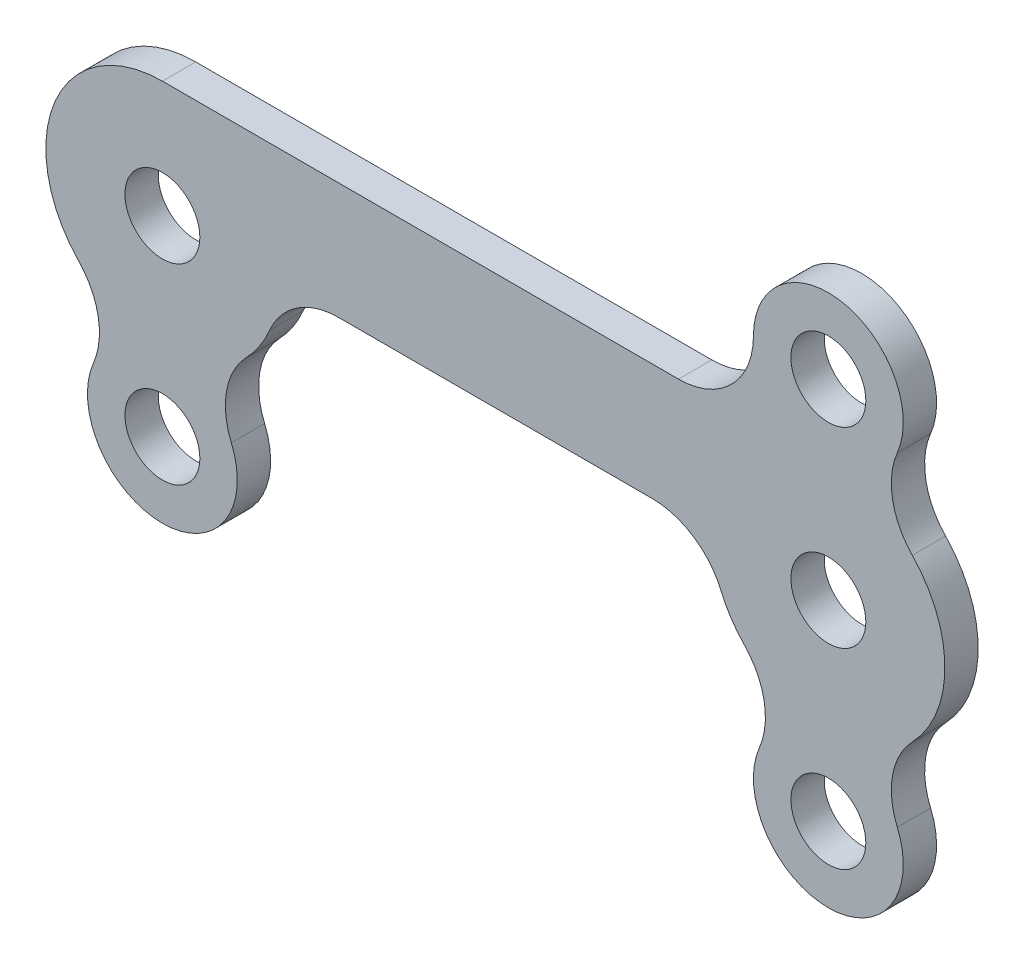
ISO-10303-21;
HEADER;
FILE_DESCRIPTION(('STEP AP214'),'2;1');
FILE_NAME('part.step','',(''),(''),'','','');
FILE_SCHEMA(('AUTOMOTIVE_DESIGN { 1 0 10303 214 1 1 1 1 }'));
ENDSEC;
DATA;
#1=APPLICATION_CONTEXT('core data for automotive mechanical design processes');
#2=APPLICATION_PROTOCOL_DEFINITION('international standard','automotive_design',2000,#1);
#3=PRODUCT_CONTEXT('',#1,'mechanical');
#4=PRODUCT('Part','Part','',(#3));
#5=PRODUCT_RELATED_PRODUCT_CATEGORY('part','',(#4));
#6=PRODUCT_DEFINITION_FORMATION('','',#4);
#7=PRODUCT_DEFINITION_CONTEXT('part definition',#1,'design');
#8=PRODUCT_DEFINITION('design','',#6,#7);
#9=PRODUCT_DEFINITION_SHAPE('','',#8);
#10=(LENGTH_UNIT() NAMED_UNIT(*) SI_UNIT(.MILLI.,.METRE.));
#11=(NAMED_UNIT(*) PLANE_ANGLE_UNIT() SI_UNIT($,.RADIAN.));
#12=(NAMED_UNIT(*) SI_UNIT($,.STERADIAN.) SOLID_ANGLE_UNIT());
#13=UNCERTAINTY_MEASURE_WITH_UNIT(LENGTH_MEASURE(1.E-05),#10,'distance_accuracy_value','');
#14=(GEOMETRIC_REPRESENTATION_CONTEXT(3) GLOBAL_UNCERTAINTY_ASSIGNED_CONTEXT((#13)) GLOBAL_UNIT_ASSIGNED_CONTEXT((#10,
#11,#12)) REPRESENTATION_CONTEXT('',''));
#15=CARTESIAN_POINT('',(0.,0.,0.));
#16=DIRECTION('',(0.,0.,1.));
#17=DIRECTION('',(1.,0.,0.));
#18=AXIS2_PLACEMENT_3D('',#15,#16,#17);
#19=CARTESIAN_POINT('',(31.75,9.128125,1.5875));
#20=DIRECTION('',(0.,0.,-1.));
#21=DIRECTION('',(-1.,0.,0.));
#22=AXIS2_PLACEMENT_3D('',#19,#20,#21);
#23=CYLINDRICAL_SURFACE('',#22,3.57187499999999);
#24=CARTESIAN_POINT('',(31.75,9.128125,0.));
#25=DIRECTION('',(0.,0.,1.));
#26=DIRECTION('',(1.,0.,0.));
#27=AXIS2_PLACEMENT_3D('',#24,#25,#26);
#28=CIRCLE('',#27,3.57187499999999);
#29=CARTESIAN_POINT('',(35.0370584223335,7.7304347826087,0.));
#30=VERTEX_POINT('',#29);
#31=CARTESIAN_POINT('',(28.178125,9.128125,0.));
#32=VERTEX_POINT('',#31);
#33=EDGE_CURVE('E177',#30,#32,#28,.T.);
#34=ORIENTED_EDGE('',*,*,#33,.T.);
#35=DIRECTION('',(0.,0.,-1.));
#36=VECTOR('',#35,1.);
#37=CARTESIAN_POINT('',(28.178125,9.128125,1.5875));
#38=LINE('',#37,#36);
#39=CARTESIAN_POINT('',(28.178125,9.128125,1.5875));
#40=VERTEX_POINT('',#39);
#41=EDGE_CURVE('E175',#40,#32,#38,.T.);
#42=ORIENTED_EDGE('',*,*,#41,.F.);
#43=CARTESIAN_POINT('',(31.75,9.128125,1.5875));
#44=DIRECTION('',(0.,0.,1.));
#45=DIRECTION('',(1.,0.,0.));
#46=AXIS2_PLACEMENT_3D('',#43,#44,#45);
#47=CIRCLE('',#46,3.57187499999999);
#48=CARTESIAN_POINT('',(35.0370584223335,7.7304347826087,1.5875));
#49=VERTEX_POINT('',#48);
#50=EDGE_CURVE('E160',#49,#40,#47,.T.);
#51=ORIENTED_EDGE('',*,*,#50,.F.);
#52=DIRECTION('',(0.,0.,-1.));
#53=VECTOR('',#52,1.);
#54=CARTESIAN_POINT('',(35.0370584223335,7.7304347826087,1.5875));
#55=LINE('',#54,#53);
#56=EDGE_CURVE('E244',#49,#30,#55,.T.);
#57=ORIENTED_EDGE('',*,*,#56,.T.);
#58=EDGE_LOOP('',(#34,#42,#51,#57));
#59=FACE_BOUND('',#58,.T.);
#60=ADVANCED_FACE('F41',(#59),#23,.T.);
#61=CARTESIAN_POINT('',(24.60625,9.128125,1.5875));
#62=DIRECTION('',(0.,0.,-1.));
#63=DIRECTION('',(-1.,0.,0.));
#64=AXIS2_PLACEMENT_3D('',#61,#62,#63);
#65=CYLINDRICAL_SURFACE('',#64,3.571875);
#66=CARTESIAN_POINT('',(24.60625,9.128125,0.));
#67=DIRECTION('',(0.,0.,1.));
#68=DIRECTION('',(1.,0.,0.));
#69=AXIS2_PLACEMENT_3D('',#66,#67,#68);
#70=CIRCLE('',#69,3.571875);
#71=CARTESIAN_POINT('',(24.60625,5.55625,0.));
#72=VERTEX_POINT('',#71);
#73=EDGE_CURVE('E251',#72,#32,#70,.T.);
#74=ORIENTED_EDGE('',*,*,#73,.F.);
#75=DIRECTION('',(0.,0.,-1.));
#76=VECTOR('',#75,1.);
#77=CARTESIAN_POINT('',(24.60625,5.55625,1.5875));
#78=LINE('',#77,#76);
#79=CARTESIAN_POINT('',(24.60625,5.55625,1.5875));
#80=VERTEX_POINT('',#79);
#81=EDGE_CURVE('E183',#80,#72,#78,.T.);
#82=ORIENTED_EDGE('',*,*,#81,.F.);
#83=CARTESIAN_POINT('',(24.60625,9.128125,1.5875));
#84=DIRECTION('',(0.,0.,1.));
#85=DIRECTION('',(1.,0.,0.));
#86=AXIS2_PLACEMENT_3D('',#83,#84,#85);
#87=CIRCLE('',#86,3.571875);
#88=EDGE_CURVE('E166',#80,#40,#87,.T.);
#89=ORIENTED_EDGE('',*,*,#88,.T.);
#90=ORIENTED_EDGE('',*,*,#41,.T.);
#91=EDGE_LOOP('',(#74,#82,#89,#90));
#92=FACE_BOUND('',#91,.T.);
#93=ADVANCED_FACE('F185',(#92),#65,.F.);
#94=CARTESIAN_POINT('',(0.,5.55625,1.5875));
#95=DIRECTION('',(0.,1.,0.));
#96=DIRECTION('',(0.,0.,1.));
#97=AXIS2_PLACEMENT_3D('',#94,#95,#96);
#98=PLANE('',#97);
#99=DIRECTION('',(1.,0.,0.));
#100=VECTOR('',#99,1.);
#101=CARTESIAN_POINT('',(0.,5.55625,0.));
#102=LINE('',#101,#100);
#103=CARTESIAN_POINT('',(0.,5.55625,0.));
#104=VERTEX_POINT('',#103);
#105=EDGE_CURVE('E254',#104,#72,#102,.T.);
#106=ORIENTED_EDGE('',*,*,#105,.F.);
#107=DIRECTION('',(0.,0.,-1.));
#108=VECTOR('',#107,1.);
#109=CARTESIAN_POINT('',(0.,5.55625,1.5875));
#110=LINE('',#109,#108);
#111=CARTESIAN_POINT('',(0.,5.55625,1.5875));
#112=VERTEX_POINT('',#111);
#113=EDGE_CURVE('E345',#112,#104,#110,.T.);
#114=ORIENTED_EDGE('',*,*,#113,.F.);
#115=DIRECTION('',(1.,0.,0.));
#116=VECTOR('',#115,1.);
#117=CARTESIAN_POINT('',(0.,5.55625,1.5875));
#118=LINE('',#117,#116);
#119=EDGE_CURVE('E187',#112,#80,#118,.T.);
#120=ORIENTED_EDGE('',*,*,#119,.T.);
#121=ORIENTED_EDGE('',*,*,#81,.T.);
#122=EDGE_LOOP('',(#106,#114,#120,#121));
#123=FACE_BOUND('',#122,.T.);
#124=ADVANCED_FACE('F406',(#123),#98,.T.);
#125=CARTESIAN_POINT('',(0.,0.,1.5875));
#126=DIRECTION('',(0.,0.,-1.));
#127=DIRECTION('',(-1.,0.,0.));
#128=AXIS2_PLACEMENT_3D('',#125,#126,#127);
#129=CYLINDRICAL_SURFACE('',#128,5.55625);
#130=CARTESIAN_POINT('',(0.,0.,0.));
#131=DIRECTION('',(0.,0.,1.));
#132=DIRECTION('',(1.,0.,0.));
#133=AXIS2_PLACEMENT_3D('',#130,#131,#132);
#134=CIRCLE('',#133,5.55625);
#135=CARTESIAN_POINT('',(-4.00163634023209,-3.8547140831758,0.));
#136=VERTEX_POINT('',#135);
#137=EDGE_CURVE('E258',#104,#136,#134,.T.);
#138=ORIENTED_EDGE('',*,*,#137,.T.);
#139=DIRECTION('',(0.,0.,-1.));
#140=VECTOR('',#139,1.);
#141=CARTESIAN_POINT('',(-4.00163634023209,-3.8547140831758,1.5875));
#142=LINE('',#141,#140);
#143=CARTESIAN_POINT('',(-4.00163634023209,-3.8547140831758,1.5875));
#144=VERTEX_POINT('',#143);
#145=EDGE_CURVE('E342',#144,#136,#142,.T.);
#146=ORIENTED_EDGE('',*,*,#145,.F.);
#147=CARTESIAN_POINT('',(0.,0.,1.5875));
#148=DIRECTION('',(0.,0.,1.));
#149=DIRECTION('',(1.,0.,0.));
#150=AXIS2_PLACEMENT_3D('',#147,#148,#149);
#151=CIRCLE('',#150,5.55625);
#152=EDGE_CURVE('E190',#112,#144,#151,.T.);
#153=ORIENTED_EDGE('',*,*,#152,.F.);
#154=ORIENTED_EDGE('',*,*,#113,.T.);
#155=EDGE_LOOP('',(#138,#146,#153,#154));
#156=FACE_BOUND('',#155,.T.);
#157=ADVANCED_FACE('F411',(#156),#129,.T.);
#158=CARTESIAN_POINT('',(-6.57411684466701,-6.33274456521739,1.5875));
#159=DIRECTION('',(0.,0.,-1.));
#160=DIRECTION('',(-1.,0.,0.));
#161=AXIS2_PLACEMENT_3D('',#158,#159,#160);
#162=CYLINDRICAL_SURFACE('',#161,3.57187499999999);
#163=CARTESIAN_POINT('',(-6.57411684466701,-6.33274456521739,0.));
#164=DIRECTION('',(0.,0.,1.));
#165=DIRECTION('',(1.,0.,0.));
#166=AXIS2_PLACEMENT_3D('',#163,#164,#165);
#167=CIRCLE('',#166,3.57187499999999);
#168=CARTESIAN_POINT('',(-3.2870584223335,-7.7304347826087,0.));
#169=VERTEX_POINT('',#168);
#170=EDGE_CURVE('E262',#169,#136,#167,.T.);
#171=ORIENTED_EDGE('',*,*,#170,.F.);
#172=DIRECTION('',(0.,0.,-1.));
#173=VECTOR('',#172,1.);
#174=CARTESIAN_POINT('',(-3.2870584223335,-7.7304347826087,1.5875));
#175=LINE('',#174,#173);
#176=CARTESIAN_POINT('',(-3.2870584223335,-7.7304347826087,1.5875));
#177=VERTEX_POINT('',#176);
#178=EDGE_CURVE('E339',#177,#169,#175,.T.);
#179=ORIENTED_EDGE('',*,*,#178,.F.);
#180=CARTESIAN_POINT('',(-6.57411684466701,-6.33274456521739,1.5875));
#181=DIRECTION('',(0.,0.,1.));
#182=DIRECTION('',(1.,0.,0.));
#183=AXIS2_PLACEMENT_3D('',#180,#181,#182);
#184=CIRCLE('',#183,3.57187499999999);
#185=EDGE_CURVE('E196',#177,#144,#184,.T.);
#186=ORIENTED_EDGE('',*,*,#185,.T.);
#187=ORIENTED_EDGE('',*,*,#145,.T.);
#188=EDGE_LOOP('',(#171,#179,#186,#187));
#189=FACE_BOUND('',#188,.T.);
#190=ADVANCED_FACE('F414',(#189),#162,.F.);
#191=CARTESIAN_POINT('',(0.,-9.128125,1.5875));
#192=DIRECTION('',(0.,0.,-1.));
#193=DIRECTION('',(-1.,0.,0.));
#194=AXIS2_PLACEMENT_3D('',#191,#192,#193);
#195=CYLINDRICAL_SURFACE('',#194,3.57187499999999);
#196=CARTESIAN_POINT('',(0.,-9.128125,0.));
#197=DIRECTION('',(0.,0.,1.));
#198=DIRECTION('',(1.,0.,0.));
#199=AXIS2_PLACEMENT_3D('',#196,#197,#198);
#200=CIRCLE('',#199,3.57187499999999);
#201=CARTESIAN_POINT('',(3.2870584223335,-7.7304347826087,0.));
#202=VERTEX_POINT('',#201);
#203=EDGE_CURVE('E267',#169,#202,#200,.T.);
#204=ORIENTED_EDGE('',*,*,#203,.T.);
#205=DIRECTION('',(0.,0.,-1.));
#206=VECTOR('',#205,1.);
#207=CARTESIAN_POINT('',(3.2870584223335,-7.7304347826087,1.5875));
#208=LINE('',#207,#206);
#209=CARTESIAN_POINT('',(3.2870584223335,-7.7304347826087,1.5875));
#210=VERTEX_POINT('',#209);
#211=EDGE_CURVE('E336',#210,#202,#208,.T.);
#212=ORIENTED_EDGE('',*,*,#211,.F.);
#213=CARTESIAN_POINT('',(0.,-9.128125,1.5875));
#214=DIRECTION('',(0.,0.,1.));
#215=DIRECTION('',(1.,0.,0.));
#216=AXIS2_PLACEMENT_3D('',#213,#214,#215);
#217=CIRCLE('',#216,3.57187499999999);
#218=EDGE_CURVE('E201',#177,#210,#217,.T.);
#219=ORIENTED_EDGE('',*,*,#218,.F.);
#220=ORIENTED_EDGE('',*,*,#178,.T.);
#221=EDGE_LOOP('',(#204,#212,#219,#220));
#222=FACE_BOUND('',#221,.T.);
#223=ADVANCED_FACE('F419',(#222),#195,.T.);
#224=CARTESIAN_POINT('',(6.57411684466701,-6.33274456521739,1.5875));
#225=DIRECTION('',(0.,0.,-1.));
#226=DIRECTION('',(-1.,0.,0.));
#227=AXIS2_PLACEMENT_3D('',#224,#225,#226);
#228=CYLINDRICAL_SURFACE('',#227,3.571875);
#229=CARTESIAN_POINT('',(6.57411684466701,-6.33274456521739,0.));
#230=DIRECTION('',(0.,0.,1.));
#231=DIRECTION('',(1.,0.,0.));
#232=AXIS2_PLACEMENT_3D('',#229,#230,#231);
#233=CIRCLE('',#232,3.571875);
#234=CARTESIAN_POINT('',(4.00163634023209,-3.8547140831758,0.));
#235=VERTEX_POINT('',#234);
#236=EDGE_CURVE('E271',#235,#202,#233,.T.);
#237=ORIENTED_EDGE('',*,*,#236,.F.);
#238=DIRECTION('',(0.,0.,-1.));
#239=VECTOR('',#238,1.);
#240=CARTESIAN_POINT('',(4.00163634023209,-3.8547140831758,1.5875));
#241=LINE('',#240,#239);
#242=CARTESIAN_POINT('',(4.00163634023209,-3.8547140831758,1.5875));
#243=VERTEX_POINT('',#242);
#244=EDGE_CURVE('E333',#243,#235,#241,.T.);
#245=ORIENTED_EDGE('',*,*,#244,.F.);
#246=CARTESIAN_POINT('',(6.57411684466701,-6.33274456521739,1.5875));
#247=DIRECTION('',(0.,0.,1.));
#248=DIRECTION('',(1.,0.,0.));
#249=AXIS2_PLACEMENT_3D('',#246,#247,#248);
#250=CIRCLE('',#249,3.571875);
#251=EDGE_CURVE('E204',#243,#210,#250,.T.);
#252=ORIENTED_EDGE('',*,*,#251,.T.);
#253=ORIENTED_EDGE('',*,*,#211,.T.);
#254=EDGE_LOOP('',(#237,#245,#252,#253));
#255=FACE_BOUND('',#254,.T.);
#256=ADVANCED_FACE('F426',(#255),#228,.F.);
#257=CARTESIAN_POINT('',(5.11320199029657,-2.1741847826087,0.));
#258=VERTEX_POINT('',#257);
#259=EDGE_CURVE('E263',#235,#258,#134,.T.);
#260=ORIENTED_EDGE('',*,*,#259,.T.);
#261=DIRECTION('',(0.,0.,-1.));
#262=VECTOR('',#261,1.);
#263=CARTESIAN_POINT('',(5.11320199029657,-2.1741847826087,1.5875));
#264=LINE('',#263,#262);
#265=CARTESIAN_POINT('',(5.11320199029657,-2.1741847826087,1.5875));
#266=VERTEX_POINT('',#265);
#267=EDGE_CURVE('E356',#258,#266,#264,.F.);
#268=ORIENTED_EDGE('',*,*,#267,.T.);
#269=EDGE_CURVE('E197',#243,#266,#151,.T.);
#270=ORIENTED_EDGE('',*,*,#269,.F.);
#271=ORIENTED_EDGE('',*,*,#244,.T.);
#272=EDGE_LOOP('',(#260,#268,#270,#271));
#273=FACE_BOUND('',#272,.T.);
#274=ADVANCED_FACE('F430',(#273),#129,.T.);
#275=CARTESIAN_POINT('',(0.,0.,1.5875));
#276=DIRECTION('',(0.,1.,0.));
#277=DIRECTION('',(0.,0.,1.));
#278=AXIS2_PLACEMENT_3D('',#275,#276,#277);
#279=PLANE('',#278);
#280=DIRECTION('',(1.,0.,0.));
#281=VECTOR('',#280,1.);
#282=CARTESIAN_POINT('',(0.,0.,1.5875));
#283=LINE('',#282,#281);
#284=CARTESIAN_POINT('',(8.40026041263007,0.,1.5875));
#285=VERTEX_POINT('',#284);
#286=CARTESIAN_POINT('',(23.3497395873699,0.,1.5875));
#287=VERTEX_POINT('',#286);
#288=EDGE_CURVE('E208',#285,#287,#283,.T.);
#289=ORIENTED_EDGE('',*,*,#288,.F.);
#290=DIRECTION('',(0.,0.,1.));
#291=VECTOR('',#290,1.);
#292=CARTESIAN_POINT('',(8.40026041263007,0.,0.));
#293=LINE('',#292,#291);
#294=CARTESIAN_POINT('',(8.40026041263007,0.,0.));
#295=VERTEX_POINT('',#294);
#296=EDGE_CURVE('E352',#285,#295,#293,.F.);
#297=ORIENTED_EDGE('',*,*,#296,.T.);
#298=DIRECTION('',(1.,0.,0.));
#299=VECTOR('',#298,1.);
#300=CARTESIAN_POINT('',(0.,0.,0.));
#301=LINE('',#300,#299);
#302=CARTESIAN_POINT('',(23.3497395873699,0.,0.));
#303=VERTEX_POINT('',#302);
#304=EDGE_CURVE('E275',#295,#303,#301,.T.);
#305=ORIENTED_EDGE('',*,*,#304,.T.);
#306=DIRECTION('',(0.,0.,1.));
#307=VECTOR('',#306,1.);
#308=CARTESIAN_POINT('',(23.3497395873699,0.,1.5875));
#309=LINE('',#308,#307);
#310=EDGE_CURVE('E182',#303,#287,#309,.T.);
#311=ORIENTED_EDGE('',*,*,#310,.T.);
#312=EDGE_LOOP('',(#289,#297,#305,#311));
#313=FACE_BOUND('',#312,.T.);
#314=ADVANCED_FACE('F375',(#313),#279,.F.);
#315=CARTESIAN_POINT('',(31.75,0.,1.5875));
#316=DIRECTION('',(0.,0.,-1.));
#317=DIRECTION('',(-1.,0.,0.));
#318=AXIS2_PLACEMENT_3D('',#315,#316,#317);
#319=CYLINDRICAL_SURFACE('',#318,5.55625);
#320=CARTESIAN_POINT('',(31.75,0.,1.5875));
#321=DIRECTION('',(0.,0.,1.));
#322=DIRECTION('',(1.,0.,0.));
#323=AXIS2_PLACEMENT_3D('',#320,#321,#322);
#324=CIRCLE('',#323,5.55625);
#325=CARTESIAN_POINT('',(26.6367980097035,-2.1741847826087,1.5875));
#326=VERTEX_POINT('',#325);
#327=CARTESIAN_POINT('',(27.7483636597679,-3.8547140831758,1.5875));
#328=VERTEX_POINT('',#327);
#329=EDGE_CURVE('E211',#326,#328,#324,.T.);
#330=ORIENTED_EDGE('',*,*,#329,.F.);
#331=DIRECTION('',(0.,0.,-1.));
#332=VECTOR('',#331,1.);
#333=CARTESIAN_POINT('',(26.6367980097035,-2.1741847826087,1.5875));
#334=LINE('',#333,#332);
#335=CARTESIAN_POINT('',(26.6367980097035,-2.1741847826087,0.));
#336=VERTEX_POINT('',#335);
#337=EDGE_CURVE('E359',#326,#336,#334,.T.);
#338=ORIENTED_EDGE('',*,*,#337,.T.);
#339=CARTESIAN_POINT('',(31.75,0.,0.));
#340=DIRECTION('',(0.,0.,1.));
#341=DIRECTION('',(1.,0.,0.));
#342=AXIS2_PLACEMENT_3D('',#339,#340,#341);
#343=CIRCLE('',#342,5.55625);
#344=CARTESIAN_POINT('',(27.7483636597679,-3.8547140831758,0.));
#345=VERTEX_POINT('',#344);
#346=EDGE_CURVE('E279',#336,#345,#343,.T.);
#347=ORIENTED_EDGE('',*,*,#346,.T.);
#348=DIRECTION('',(0.,0.,-1.));
#349=VECTOR('',#348,1.);
#350=CARTESIAN_POINT('',(27.7483636597679,-3.8547140831758,1.5875));
#351=LINE('',#350,#349);
#352=EDGE_CURVE('E329',#328,#345,#351,.T.);
#353=ORIENTED_EDGE('',*,*,#352,.F.);
#354=EDGE_LOOP('',(#330,#338,#347,#353));
#355=FACE_BOUND('',#354,.T.);
#356=ADVANCED_FACE('F378',(#355),#319,.T.);
#357=CARTESIAN_POINT('',(25.175883155333,-6.33274456521739,1.5875));
#358=DIRECTION('',(0.,0.,-1.));
#359=DIRECTION('',(-1.,0.,0.));
#360=AXIS2_PLACEMENT_3D('',#357,#358,#359);
#361=CYLINDRICAL_SURFACE('',#360,3.57187499999999);
#362=CARTESIAN_POINT('',(25.175883155333,-6.33274456521739,0.));
#363=DIRECTION('',(0.,0.,1.));
#364=DIRECTION('',(1.,0.,0.));
#365=AXIS2_PLACEMENT_3D('',#362,#363,#364);
#366=CIRCLE('',#365,3.57187499999999);
#367=CARTESIAN_POINT('',(28.4629415776665,-7.7304347826087,0.));
#368=VERTEX_POINT('',#367);
#369=EDGE_CURVE('E282',#368,#345,#366,.T.);
#370=ORIENTED_EDGE('',*,*,#369,.F.);
#371=DIRECTION('',(0.,0.,-1.));
#372=VECTOR('',#371,1.);
#373=CARTESIAN_POINT('',(28.4629415776665,-7.7304347826087,1.5875));
#374=LINE('',#373,#372);
#375=CARTESIAN_POINT('',(28.4629415776665,-7.7304347826087,1.5875));
#376=VERTEX_POINT('',#375);
#377=EDGE_CURVE('E326',#376,#368,#374,.T.);
#378=ORIENTED_EDGE('',*,*,#377,.F.);
#379=CARTESIAN_POINT('',(25.175883155333,-6.33274456521739,1.5875));
#380=DIRECTION('',(0.,0.,1.));
#381=DIRECTION('',(1.,0.,0.));
#382=AXIS2_PLACEMENT_3D('',#379,#380,#381);
#383=CIRCLE('',#382,3.57187499999999);
#384=EDGE_CURVE('E214',#376,#328,#383,.T.);
#385=ORIENTED_EDGE('',*,*,#384,.T.);
#386=ORIENTED_EDGE('',*,*,#352,.T.);
#387=EDGE_LOOP('',(#370,#378,#385,#386));
#388=FACE_BOUND('',#387,.T.);
#389=ADVANCED_FACE('F386',(#388),#361,.F.);
#390=CARTESIAN_POINT('',(31.75,-9.128125,1.5875));
#391=DIRECTION('',(0.,0.,-1.));
#392=DIRECTION('',(-1.,0.,0.));
#393=AXIS2_PLACEMENT_3D('',#390,#391,#392);
#394=CYLINDRICAL_SURFACE('',#393,3.57187499999999);
#395=CARTESIAN_POINT('',(31.75,-9.128125,0.));
#396=DIRECTION('',(0.,0.,1.));
#397=DIRECTION('',(1.,0.,0.));
#398=AXIS2_PLACEMENT_3D('',#395,#396,#397);
#399=CIRCLE('',#398,3.57187499999999);
#400=CARTESIAN_POINT('',(35.0370584223335,-7.7304347826087,0.));
#401=VERTEX_POINT('',#400);
#402=EDGE_CURVE('E287',#368,#401,#399,.T.);
#403=ORIENTED_EDGE('',*,*,#402,.T.);
#404=DIRECTION('',(0.,0.,-1.));
#405=VECTOR('',#404,1.);
#406=CARTESIAN_POINT('',(35.0370584223335,-7.7304347826087,1.5875));
#407=LINE('',#406,#405);
#408=CARTESIAN_POINT('',(35.0370584223335,-7.7304347826087,1.5875));
#409=VERTEX_POINT('',#408);
#410=EDGE_CURVE('E323',#409,#401,#407,.T.);
#411=ORIENTED_EDGE('',*,*,#410,.F.);
#412=CARTESIAN_POINT('',(31.75,-9.128125,1.5875));
#413=DIRECTION('',(0.,0.,1.));
#414=DIRECTION('',(1.,0.,0.));
#415=AXIS2_PLACEMENT_3D('',#412,#413,#414);
#416=CIRCLE('',#415,3.57187499999999);
#417=EDGE_CURVE('E219',#376,#409,#416,.T.);
#418=ORIENTED_EDGE('',*,*,#417,.F.);
#419=ORIENTED_EDGE('',*,*,#377,.T.);
#420=EDGE_LOOP('',(#403,#411,#418,#419));
#421=FACE_BOUND('',#420,.T.);
#422=ADVANCED_FACE('F389',(#421),#394,.T.);
#423=CARTESIAN_POINT('',(38.324116844667,-6.33274456521739,1.5875));
#424=DIRECTION('',(0.,0.,-1.));
#425=DIRECTION('',(-1.,0.,0.));
#426=AXIS2_PLACEMENT_3D('',#423,#424,#425);
#427=CYLINDRICAL_SURFACE('',#426,3.571875);
#428=CARTESIAN_POINT('',(38.324116844667,-6.33274456521739,0.));
#429=DIRECTION('',(0.,0.,1.));
#430=DIRECTION('',(1.,0.,0.));
#431=AXIS2_PLACEMENT_3D('',#428,#429,#430);
#432=CIRCLE('',#431,3.571875);
#433=CARTESIAN_POINT('',(35.7516363402321,-3.8547140831758,0.));
#434=VERTEX_POINT('',#433);
#435=EDGE_CURVE('E291',#434,#401,#432,.T.);
#436=ORIENTED_EDGE('',*,*,#435,.F.);
#437=DIRECTION('',(0.,0.,-1.));
#438=VECTOR('',#437,1.);
#439=CARTESIAN_POINT('',(35.7516363402321,-3.8547140831758,1.5875));
#440=LINE('',#439,#438);
#441=CARTESIAN_POINT('',(35.7516363402321,-3.8547140831758,1.5875));
#442=VERTEX_POINT('',#441);
#443=EDGE_CURVE('E320',#442,#434,#440,.T.);
#444=ORIENTED_EDGE('',*,*,#443,.F.);
#445=CARTESIAN_POINT('',(38.324116844667,-6.33274456521739,1.5875));
#446=DIRECTION('',(0.,0.,1.));
#447=DIRECTION('',(1.,0.,0.));
#448=AXIS2_PLACEMENT_3D('',#445,#446,#447);
#449=CIRCLE('',#448,3.571875);
#450=EDGE_CURVE('E222',#442,#409,#449,.T.);
#451=ORIENTED_EDGE('',*,*,#450,.T.);
#452=ORIENTED_EDGE('',*,*,#410,.T.);
#453=EDGE_LOOP('',(#436,#444,#451,#452));
#454=FACE_BOUND('',#453,.T.);
#455=ADVANCED_FACE('F392',(#454),#427,.F.);
#456=CARTESIAN_POINT('',(35.7516363402321,3.8547140831758,0.));
#457=VERTEX_POINT('',#456);
#458=EDGE_CURVE('E283',#434,#457,#343,.T.);
#459=ORIENTED_EDGE('',*,*,#458,.T.);
#460=DIRECTION('',(0.,0.,-1.));
#461=VECTOR('',#460,1.);
#462=CARTESIAN_POINT('',(35.7516363402321,3.8547140831758,1.5875));
#463=LINE('',#462,#461);
#464=CARTESIAN_POINT('',(35.7516363402321,3.8547140831758,1.5875));
#465=VERTEX_POINT('',#464);
#466=EDGE_CURVE('E317',#465,#457,#463,.T.);
#467=ORIENTED_EDGE('',*,*,#466,.F.);
#468=EDGE_CURVE('E215',#442,#465,#324,.T.);
#469=ORIENTED_EDGE('',*,*,#468,.F.);
#470=ORIENTED_EDGE('',*,*,#443,.T.);
#471=EDGE_LOOP('',(#459,#467,#469,#470));
#472=FACE_BOUND('',#471,.T.);
#473=ADVANCED_FACE('F398',(#472),#319,.T.);
#474=CARTESIAN_POINT('',(0.,-9.128125,1.5875));
#475=DIRECTION('',(0.,0.,-1.));
#476=DIRECTION('',(-1.,0.,0.));
#477=AXIS2_PLACEMENT_3D('',#474,#475,#476);
#478=CYLINDRICAL_SURFACE('',#477,1.7859375);
#479=CARTESIAN_POINT('',(0.,-9.128125,1.5875));
#480=DIRECTION('',(0.,0.,1.));
#481=DIRECTION('',(1.,0.,0.));
#482=AXIS2_PLACEMENT_3D('',#479,#480,#481);
#483=CIRCLE('',#482,1.7859375);
#484=CARTESIAN_POINT('',(1.7859375,-9.128125,1.5875));
#485=VERTEX_POINT('',#484);
#486=EDGE_CURVE('E236',#485,#485,#483,.T.);
#487=ORIENTED_EDGE('',*,*,#486,.T.);
#488=EDGE_LOOP('',(#487));
#489=FACE_BOUND('',#488,.T.);
#490=CARTESIAN_POINT('',(0.,-9.128125,0.));
#491=DIRECTION('',(0.,0.,1.));
#492=DIRECTION('',(1.,0.,0.));
#493=AXIS2_PLACEMENT_3D('',#490,#491,#492);
#494=CIRCLE('',#493,1.7859375);
#495=CARTESIAN_POINT('',(1.7859375,-9.128125,0.));
#496=VERTEX_POINT('',#495);
#497=EDGE_CURVE('E307',#496,#496,#494,.T.);
#498=ORIENTED_EDGE('',*,*,#497,.F.);
#499=EDGE_LOOP('',(#498));
#500=FACE_BOUND('',#499,.T.);
#501=ADVANCED_FACE('F557',(#489,#500),#478,.F.);
#502=CARTESIAN_POINT('',(31.75,0.,1.5875));
#503=DIRECTION('',(0.,0.,-1.));
#504=DIRECTION('',(-1.,0.,0.));
#505=AXIS2_PLACEMENT_3D('',#502,#503,#504);
#506=CYLINDRICAL_SURFACE('',#505,1.7859375);
#507=CARTESIAN_POINT('',(31.75,0.,1.5875));
#508=DIRECTION('',(0.,0.,1.));
#509=DIRECTION('',(1.,0.,0.));
#510=AXIS2_PLACEMENT_3D('',#507,#508,#509);
#511=CIRCLE('',#510,1.7859375);
#512=CARTESIAN_POINT('',(33.5359375,0.,1.5875));
#513=VERTEX_POINT('',#512);
#514=EDGE_CURVE('E232',#513,#513,#511,.T.);
#515=ORIENTED_EDGE('',*,*,#514,.T.);
#516=EDGE_LOOP('',(#515));
#517=FACE_BOUND('',#516,.T.);
#518=CARTESIAN_POINT('',(31.75,0.,0.));
#519=DIRECTION('',(0.,0.,1.));
#520=DIRECTION('',(1.,0.,0.));
#521=AXIS2_PLACEMENT_3D('',#518,#519,#520);
#522=CIRCLE('',#521,1.7859375);
#523=CARTESIAN_POINT('',(33.5359375,0.,0.));
#524=VERTEX_POINT('',#523);
#525=EDGE_CURVE('E303',#524,#524,#522,.T.);
#526=ORIENTED_EDGE('',*,*,#525,.F.);
#527=EDGE_LOOP('',(#526));
#528=FACE_BOUND('',#527,.T.);
#529=ADVANCED_FACE('F547',(#517,#528),#506,.F.);
#530=CARTESIAN_POINT('',(0.,0.,1.5875));
#531=DIRECTION('',(0.,0.,-1.));
#532=DIRECTION('',(-1.,0.,0.));
#533=AXIS2_PLACEMENT_3D('',#530,#531,#532);
#534=CYLINDRICAL_SURFACE('',#533,1.7859375);
#535=CARTESIAN_POINT('',(0.,0.,1.5875));
#536=DIRECTION('',(0.,0.,1.));
#537=DIRECTION('',(1.,0.,0.));
#538=AXIS2_PLACEMENT_3D('',#535,#536,#537);
#539=CIRCLE('',#538,1.7859375);
#540=CARTESIAN_POINT('',(1.7859375,0.,1.5875));
#541=VERTEX_POINT('',#540);
#542=EDGE_CURVE('E228',#541,#541,#539,.T.);
#543=ORIENTED_EDGE('',*,*,#542,.T.);
#544=EDGE_LOOP('',(#543));
#545=FACE_BOUND('',#544,.T.);
#546=CARTESIAN_POINT('',(0.,0.,0.));
#547=DIRECTION('',(0.,0.,1.));
#548=DIRECTION('',(1.,0.,0.));
#549=AXIS2_PLACEMENT_3D('',#546,#547,#548);
#550=CIRCLE('',#549,1.7859375);
#551=CARTESIAN_POINT('',(1.7859375,0.,0.));
#552=VERTEX_POINT('',#551);
#553=EDGE_CURVE('E299',#552,#552,#550,.T.);
#554=ORIENTED_EDGE('',*,*,#553,.F.);
#555=EDGE_LOOP('',(#554));
#556=FACE_BOUND('',#555,.T.);
#557=ADVANCED_FACE('F538',(#545,#556),#534,.F.);
#558=CARTESIAN_POINT('',(38.324116844667,6.33274456521739,1.5875));
#559=DIRECTION('',(0.,0.,-1.));
#560=DIRECTION('',(-1.,0.,0.));
#561=AXIS2_PLACEMENT_3D('',#558,#559,#560);
#562=CYLINDRICAL_SURFACE('',#561,3.571875);
#563=CARTESIAN_POINT('',(38.324116844667,6.33274456521739,0.));
#564=DIRECTION('',(0.,0.,1.));
#565=DIRECTION('',(1.,0.,0.));
#566=AXIS2_PLACEMENT_3D('',#563,#564,#565);
#567=CIRCLE('',#566,3.571875);
#568=EDGE_CURVE('E295',#30,#457,#567,.T.);
#569=ORIENTED_EDGE('',*,*,#568,.F.);
#570=ORIENTED_EDGE('',*,*,#56,.F.);
#571=CARTESIAN_POINT('',(38.324116844667,6.33274456521739,1.5875));
#572=DIRECTION('',(0.,0.,1.));
#573=DIRECTION('',(1.,0.,0.));
#574=AXIS2_PLACEMENT_3D('',#571,#572,#573);
#575=CIRCLE('',#574,3.571875);
#576=EDGE_CURVE('E169',#49,#465,#575,.T.);
#577=ORIENTED_EDGE('',*,*,#576,.T.);
#578=ORIENTED_EDGE('',*,*,#466,.T.);
#579=EDGE_LOOP('',(#569,#570,#577,#578));
#580=FACE_BOUND('',#579,.T.);
#581=ADVANCED_FACE('F402',(#580),#562,.F.);
#582=CARTESIAN_POINT('',(31.75,9.128125,1.5875));
#583=DIRECTION('',(0.,0.,-1.));
#584=DIRECTION('',(-1.,0.,0.));
#585=AXIS2_PLACEMENT_3D('',#582,#583,#584);
#586=CYLINDRICAL_SURFACE('',#585,1.7859375);
#587=CARTESIAN_POINT('',(31.75,9.128125,1.5875));
#588=DIRECTION('',(0.,0.,1.));
#589=DIRECTION('',(1.,0.,0.));
#590=AXIS2_PLACEMENT_3D('',#587,#588,#589);
#591=CIRCLE('',#590,1.7859375);
#592=CARTESIAN_POINT('',(33.5359375,9.128125,1.5875));
#593=VERTEX_POINT('',#592);
#594=EDGE_CURVE('E172',#593,#593,#591,.T.);
#595=ORIENTED_EDGE('',*,*,#594,.T.);
#596=EDGE_LOOP('',(#595));
#597=FACE_BOUND('',#596,.T.);
#598=CARTESIAN_POINT('',(31.75,9.128125,0.));
#599=DIRECTION('',(0.,0.,1.));
#600=DIRECTION('',(1.,0.,0.));
#601=AXIS2_PLACEMENT_3D('',#598,#599,#600);
#602=CIRCLE('',#601,1.7859375);
#603=CARTESIAN_POINT('',(33.5359375,9.128125,0.));
#604=VERTEX_POINT('',#603);
#605=EDGE_CURVE('E245',#604,#604,#602,.T.);
#606=ORIENTED_EDGE('',*,*,#605,.F.);
#607=EDGE_LOOP('',(#606));
#608=FACE_BOUND('',#607,.T.);
#609=ADVANCED_FACE('F441',(#597,#608),#586,.F.);
#610=CARTESIAN_POINT('',(31.75,-9.128125,1.5875));
#611=DIRECTION('',(0.,0.,-1.));
#612=DIRECTION('',(-1.,0.,0.));
#613=AXIS2_PLACEMENT_3D('',#610,#611,#612);
#614=CYLINDRICAL_SURFACE('',#613,1.7859375);
#615=CARTESIAN_POINT('',(31.75,-9.128125,1.5875));
#616=DIRECTION('',(0.,0.,1.));
#617=DIRECTION('',(1.,0.,0.));
#618=AXIS2_PLACEMENT_3D('',#615,#616,#617);
#619=CIRCLE('',#618,1.7859375);
#620=CARTESIAN_POINT('',(33.5359375,-9.128125,1.5875));
#621=VERTEX_POINT('',#620);
#622=EDGE_CURVE('E240',#621,#621,#619,.T.);
#623=ORIENTED_EDGE('',*,*,#622,.T.);
#624=EDGE_LOOP('',(#623));
#625=FACE_BOUND('',#624,.T.);
#626=CARTESIAN_POINT('',(31.75,-9.128125,0.));
#627=DIRECTION('',(0.,0.,1.));
#628=DIRECTION('',(1.,0.,0.));
#629=AXIS2_PLACEMENT_3D('',#626,#627,#628);
#630=CIRCLE('',#629,1.7859375);
#631=CARTESIAN_POINT('',(33.5359375,-9.128125,0.));
#632=VERTEX_POINT('',#631);
#633=EDGE_CURVE('E311',#632,#632,#630,.T.);
#634=ORIENTED_EDGE('',*,*,#633,.F.);
#635=EDGE_LOOP('',(#634));
#636=FACE_BOUND('',#635,.T.);
#637=ADVANCED_FACE('F445',(#625,#636),#614,.F.);
#638=CARTESIAN_POINT('',(0.,0.,1.5875));
#639=DIRECTION('',(0.,0.,1.));
#640=DIRECTION('',(1.,0.,0.));
#641=AXIS2_PLACEMENT_3D('',#638,#639,#640);
#642=PLANE('',#641);
#643=ORIENTED_EDGE('',*,*,#594,.F.);
#644=EDGE_LOOP('',(#643));
#645=FACE_BOUND('',#644,.T.);
#646=ORIENTED_EDGE('',*,*,#50,.T.);
#647=ORIENTED_EDGE('',*,*,#88,.F.);
#648=ORIENTED_EDGE('',*,*,#119,.F.);
#649=ORIENTED_EDGE('',*,*,#152,.T.);
#650=ORIENTED_EDGE('',*,*,#185,.F.);
#651=ORIENTED_EDGE('',*,*,#218,.T.);
#652=ORIENTED_EDGE('',*,*,#251,.F.);
#653=ORIENTED_EDGE('',*,*,#269,.T.);
#654=CARTESIAN_POINT('',(8.40026041263007,-3.571875,1.5875));
#655=DIRECTION('',(0.,0.,1.));
#656=DIRECTION('',(1.,0.,0.));
#657=AXIS2_PLACEMENT_3D('',#654,#655,#656);
#658=CIRCLE('',#657,3.571875);
#659=EDGE_CURVE('E365',#266,#285,#658,.F.);
#660=ORIENTED_EDGE('',*,*,#659,.T.);
#661=ORIENTED_EDGE('',*,*,#288,.T.);
#662=CARTESIAN_POINT('',(23.3497395873699,-3.571875,1.5875));
#663=DIRECTION('',(0.,0.,1.));
#664=DIRECTION('',(1.,0.,0.));
#665=AXIS2_PLACEMENT_3D('',#662,#663,#664);
#666=CIRCLE('',#665,3.571875);
#667=EDGE_CURVE('E11',#287,#326,#666,.F.);
#668=ORIENTED_EDGE('',*,*,#667,.T.);
#669=ORIENTED_EDGE('',*,*,#329,.T.);
#670=ORIENTED_EDGE('',*,*,#384,.F.);
#671=ORIENTED_EDGE('',*,*,#417,.T.);
#672=ORIENTED_EDGE('',*,*,#450,.F.);
#673=ORIENTED_EDGE('',*,*,#468,.T.);
#674=ORIENTED_EDGE('',*,*,#576,.F.);
#675=EDGE_LOOP('',(#646,#647,#648,#649,#650,#651,#652,#653,#660,#661,#668,#669,#670,#671,#672,
#673,#674));
#676=FACE_BOUND('',#675,.T.);
#677=ORIENTED_EDGE('',*,*,#542,.F.);
#678=EDGE_LOOP('',(#677));
#679=FACE_BOUND('',#678,.T.);
#680=ORIENTED_EDGE('',*,*,#514,.F.);
#681=EDGE_LOOP('',(#680));
#682=FACE_BOUND('',#681,.T.);
#683=ORIENTED_EDGE('',*,*,#486,.F.);
#684=EDGE_LOOP('',(#683));
#685=FACE_BOUND('',#684,.T.);
#686=ORIENTED_EDGE('',*,*,#622,.F.);
#687=EDGE_LOOP('',(#686));
#688=FACE_BOUND('',#687,.T.);
#689=ADVANCED_FACE('F162',(#645,#676,#679,#682,#685,#688),#642,.T.);
#690=CARTESIAN_POINT('',(0.,0.,0.));
#691=DIRECTION('',(0.,0.,1.));
#692=DIRECTION('',(1.,0.,0.));
#693=AXIS2_PLACEMENT_3D('',#690,#691,#692);
#694=PLANE('',#693);
#695=ORIENTED_EDGE('',*,*,#605,.T.);
#696=EDGE_LOOP('',(#695));
#697=FACE_BOUND('',#696,.T.);
#698=ORIENTED_EDGE('',*,*,#33,.F.);
#699=ORIENTED_EDGE('',*,*,#568,.T.);
#700=ORIENTED_EDGE('',*,*,#458,.F.);
#701=ORIENTED_EDGE('',*,*,#435,.T.);
#702=ORIENTED_EDGE('',*,*,#402,.F.);
#703=ORIENTED_EDGE('',*,*,#369,.T.);
#704=ORIENTED_EDGE('',*,*,#346,.F.);
#705=CARTESIAN_POINT('',(23.3497395873699,-3.571875,0.));
#706=DIRECTION('',(0.,0.,1.));
#707=DIRECTION('',(1.,0.,0.));
#708=AXIS2_PLACEMENT_3D('',#705,#706,#707);
#709=CIRCLE('',#708,3.571875);
#710=EDGE_CURVE('E50',#336,#303,#709,.T.);
#711=ORIENTED_EDGE('',*,*,#710,.T.);
#712=ORIENTED_EDGE('',*,*,#304,.F.);
#713=CARTESIAN_POINT('',(8.40026041263007,-3.571875,0.));
#714=DIRECTION('',(0.,0.,1.));
#715=DIRECTION('',(1.,0.,0.));
#716=AXIS2_PLACEMENT_3D('',#713,#714,#715);
#717=CIRCLE('',#716,3.571875);
#718=EDGE_CURVE('E362',#295,#258,#717,.T.);
#719=ORIENTED_EDGE('',*,*,#718,.T.);
#720=ORIENTED_EDGE('',*,*,#259,.F.);
#721=ORIENTED_EDGE('',*,*,#236,.T.);
#722=ORIENTED_EDGE('',*,*,#203,.F.);
#723=ORIENTED_EDGE('',*,*,#170,.T.);
#724=ORIENTED_EDGE('',*,*,#137,.F.);
#725=ORIENTED_EDGE('',*,*,#105,.T.);
#726=ORIENTED_EDGE('',*,*,#73,.T.);
#727=EDGE_LOOP('',(#698,#699,#700,#701,#702,#703,#704,#711,#712,#719,#720,#721,#722,#723,#724,
#725,#726));
#728=FACE_BOUND('',#727,.T.);
#729=ORIENTED_EDGE('',*,*,#553,.T.);
#730=EDGE_LOOP('',(#729));
#731=FACE_BOUND('',#730,.T.);
#732=ORIENTED_EDGE('',*,*,#525,.T.);
#733=EDGE_LOOP('',(#732));
#734=FACE_BOUND('',#733,.T.);
#735=ORIENTED_EDGE('',*,*,#497,.T.);
#736=EDGE_LOOP('',(#735));
#737=FACE_BOUND('',#736,.T.);
#738=ORIENTED_EDGE('',*,*,#633,.T.);
#739=EDGE_LOOP('',(#738));
#740=FACE_BOUND('',#739,.T.);
#741=ADVANCED_FACE('F371',(#697,#728,#731,#734,#737,#740),#694,.F.);
#742=CARTESIAN_POINT('',(8.40026041263007,-3.571875,1.5875));
#743=DIRECTION('',(0.,0.,-1.));
#744=DIRECTION('',(-1.,0.,0.));
#745=AXIS2_PLACEMENT_3D('',#742,#743,#744);
#746=CYLINDRICAL_SURFACE('',#745,3.571875);
#747=ORIENTED_EDGE('',*,*,#659,.F.);
#748=ORIENTED_EDGE('',*,*,#267,.F.);
#749=ORIENTED_EDGE('',*,*,#718,.F.);
#750=ORIENTED_EDGE('',*,*,#296,.F.);
#751=EDGE_LOOP('',(#747,#748,#749,#750));
#752=FACE_BOUND('',#751,.T.);
#753=ADVANCED_FACE('F434',(#752),#746,.F.);
#754=CARTESIAN_POINT('',(23.3497395873699,-3.571875,1.5875));
#755=DIRECTION('',(0.,0.,-1.));
#756=DIRECTION('',(-1.,0.,0.));
#757=AXIS2_PLACEMENT_3D('',#754,#755,#756);
#758=CYLINDRICAL_SURFACE('',#757,3.571875);
#759=ORIENTED_EDGE('',*,*,#667,.F.);
#760=ORIENTED_EDGE('',*,*,#310,.F.);
#761=ORIENTED_EDGE('',*,*,#710,.F.);
#762=ORIENTED_EDGE('',*,*,#337,.F.);
#763=EDGE_LOOP('',(#759,#760,#761,#762));
#764=FACE_BOUND('',#763,.T.);
#765=ADVANCED_FACE('F43',(#764),#758,.F.);
#766=CLOSED_SHELL('',(#60,#93,#124,#157,#190,#223,#256,#274,#314,#356,#389,#422,#455,#473,#501,
#529,#557,#581,#609,#637,#689,#741,#753,#765));
#767=MANIFOLD_SOLID_BREP('B2',#766);
#768=ADVANCED_BREP_SHAPE_REPRESENTATION('',(#18,#767),#14);
#769=SHAPE_DEFINITION_REPRESENTATION(#9,#768);
ENDSEC;
END-ISO-10303-21;
